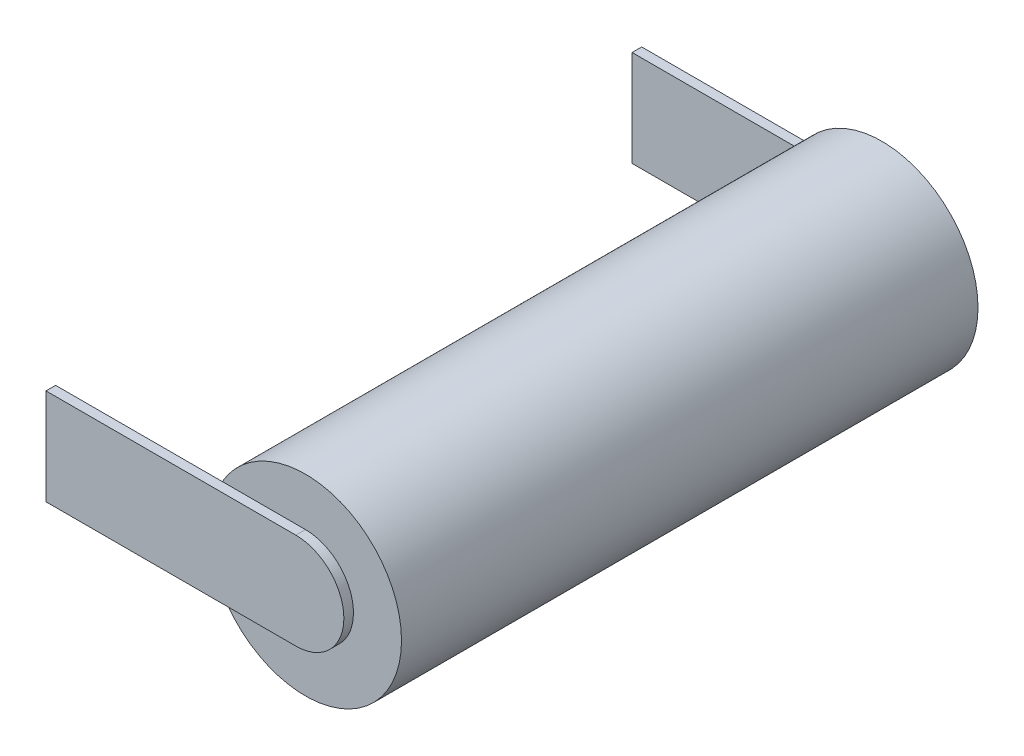
ISO-10303-21;
HEADER;
FILE_DESCRIPTION(('STEP AP214'),'2;1');
FILE_NAME('part.step','',(''),(''),'','','');
FILE_SCHEMA(('AUTOMOTIVE_DESIGN { 1 0 10303 214 1 1 1 1 }'));
ENDSEC;
DATA;
#1=APPLICATION_CONTEXT('core data for automotive mechanical design processes');
#2=APPLICATION_PROTOCOL_DEFINITION('international standard','automotive_design',2000,#1);
#3=PRODUCT_CONTEXT('',#1,'mechanical');
#4=PRODUCT('Part','Part','',(#3));
#5=PRODUCT_RELATED_PRODUCT_CATEGORY('part','',(#4));
#6=PRODUCT_DEFINITION_FORMATION('','',#4);
#7=PRODUCT_DEFINITION_CONTEXT('part definition',#1,'design');
#8=PRODUCT_DEFINITION('design','',#6,#7);
#9=PRODUCT_DEFINITION_SHAPE('','',#8);
#10=(LENGTH_UNIT() NAMED_UNIT(*) SI_UNIT(.MILLI.,.METRE.));
#11=(NAMED_UNIT(*) PLANE_ANGLE_UNIT() SI_UNIT($,.RADIAN.));
#12=(NAMED_UNIT(*) SI_UNIT($,.STERADIAN.) SOLID_ANGLE_UNIT());
#13=UNCERTAINTY_MEASURE_WITH_UNIT(LENGTH_MEASURE(1.E-05),#10,'distance_accuracy_value','');
#14=(GEOMETRIC_REPRESENTATION_CONTEXT(3) GLOBAL_UNCERTAINTY_ASSIGNED_CONTEXT((#13)) GLOBAL_UNIT_ASSIGNED_CONTEXT((#10,
#11,#12)) REPRESENTATION_CONTEXT('',''));
#15=CARTESIAN_POINT('',(0.,0.,0.));
#16=DIRECTION('',(0.,0.,1.));
#17=DIRECTION('',(1.,0.,0.));
#18=AXIS2_PLACEMENT_3D('',#15,#16,#17);
#19=CARTESIAN_POINT('',(0.,0.,15.));
#20=DIRECTION('',(0.,0.,-1.));
#21=DIRECTION('',(-1.,0.,0.));
#22=AXIS2_PLACEMENT_3D('',#19,#20,#21);
#23=PLANE('',#22);
#24=DIRECTION('',(1.,0.,0.));
#25=VECTOR('',#24,1.);
#26=CARTESIAN_POINT('',(0.,-2.5,15.));
#27=LINE('',#26,#25);
#28=CARTESIAN_POINT('',(-4.33012701892219,-2.5,15.));
#29=VERTEX_POINT('',#28);
#30=CARTESIAN_POINT('',(0.,-2.5,15.));
#31=VERTEX_POINT('',#30);
#32=EDGE_CURVE('E55',#29,#31,#27,.T.);
#33=ORIENTED_EDGE('',*,*,#32,.F.);
#34=CARTESIAN_POINT('',(0.,0.,15.));
#35=DIRECTION('',(0.,0.,1.));
#36=DIRECTION('',(1.,0.,0.));
#37=AXIS2_PLACEMENT_3D('',#34,#35,#36);
#38=CIRCLE('',#37,5.);
#39=CARTESIAN_POINT('',(-4.33012701892219,2.5,15.));
#40=VERTEX_POINT('',#39);
#41=EDGE_CURVE('E221',#29,#40,#38,.T.);
#42=ORIENTED_EDGE('',*,*,#41,.T.);
#43=DIRECTION('',(-1.,0.,0.));
#44=VECTOR('',#43,1.);
#45=CARTESIAN_POINT('',(0.,2.5,15.));
#46=LINE('',#45,#44);
#47=CARTESIAN_POINT('',(0.,2.5,15.));
#48=VERTEX_POINT('',#47);
#49=EDGE_CURVE('E204',#48,#40,#46,.T.);
#50=ORIENTED_EDGE('',*,*,#49,.F.);
#51=CARTESIAN_POINT('',(0.,0.,15.));
#52=DIRECTION('',(0.,0.,-1.));
#53=DIRECTION('',(-1.,0.,0.));
#54=AXIS2_PLACEMENT_3D('',#51,#52,#53);
#55=CIRCLE('',#54,2.5);
#56=EDGE_CURVE('E199',#48,#31,#55,.T.);
#57=ORIENTED_EDGE('',*,*,#56,.T.);
#58=EDGE_LOOP('',(#33,#42,#50,#57));
#59=FACE_BOUND('',#58,.T.);
#60=ADVANCED_FACE('F45',(#59),#23,.F.);
#61=CARTESIAN_POINT('',(0.,5.,-15.));
#62=DIRECTION('',(0.,0.,1.));
#63=DIRECTION('',(1.,0.,0.));
#64=AXIS2_PLACEMENT_3D('',#61,#62,#63);
#65=PLANE('',#64);
#66=CARTESIAN_POINT('',(0.,0.,-15.));
#67=DIRECTION('',(0.,0.,1.));
#68=DIRECTION('',(1.,0.,0.));
#69=AXIS2_PLACEMENT_3D('',#66,#67,#68);
#70=CIRCLE('',#69,5.);
#71=CARTESIAN_POINT('',(-4.33012701892219,-2.5,-15.));
#72=VERTEX_POINT('',#71);
#73=CARTESIAN_POINT('',(-4.33012701892219,2.5,-15.));
#74=VERTEX_POINT('',#73);
#75=EDGE_CURVE('E224',#72,#74,#70,.T.);
#76=ORIENTED_EDGE('',*,*,#75,.F.);
#77=DIRECTION('',(1.,0.,0.));
#78=VECTOR('',#77,1.);
#79=CARTESIAN_POINT('',(0.,-2.5,-15.));
#80=LINE('',#79,#78);
#81=CARTESIAN_POINT('',(0.,-2.5,-15.));
#82=VERTEX_POINT('',#81);
#83=EDGE_CURVE('E11',#72,#82,#80,.T.);
#84=ORIENTED_EDGE('',*,*,#83,.T.);
#85=CARTESIAN_POINT('',(0.,0.,-15.));
#86=DIRECTION('',(0.,0.,1.));
#87=DIRECTION('',(1.,0.,0.));
#88=AXIS2_PLACEMENT_3D('',#85,#86,#87);
#89=CIRCLE('',#88,2.5);
#90=CARTESIAN_POINT('',(0.,2.5,-15.));
#91=VERTEX_POINT('',#90);
#92=EDGE_CURVE('E134',#82,#91,#89,.T.);
#93=ORIENTED_EDGE('',*,*,#92,.T.);
#94=DIRECTION('',(-1.,0.,0.));
#95=VECTOR('',#94,1.);
#96=CARTESIAN_POINT('',(0.,2.5,-15.));
#97=LINE('',#96,#95);
#98=EDGE_CURVE('E160',#91,#74,#97,.T.);
#99=ORIENTED_EDGE('',*,*,#98,.T.);
#100=EDGE_LOOP('',(#76,#84,#93,#99));
#101=FACE_BOUND('',#100,.T.);
#102=ADVANCED_FACE('F47',(#101),#65,.F.);
#103=CARTESIAN_POINT('',(0.,0.,15.));
#104=DIRECTION('',(0.,0.,1.));
#105=DIRECTION('',(1.,0.,0.));
#106=AXIS2_PLACEMENT_3D('',#103,#104,#105);
#107=CYLINDRICAL_SURFACE('',#106,5.);
#108=EDGE_CURVE('E222',#40,#29,#38,.T.);
#109=ORIENTED_EDGE('',*,*,#108,.F.);
#110=ORIENTED_EDGE('',*,*,#41,.F.);
#111=EDGE_LOOP('',(#109,#110));
#112=FACE_BOUND('',#111,.T.);
#113=EDGE_CURVE('E49',#74,#72,#70,.T.);
#114=ORIENTED_EDGE('',*,*,#113,.T.);
#115=ORIENTED_EDGE('',*,*,#75,.T.);
#116=EDGE_LOOP('',(#114,#115));
#117=FACE_BOUND('',#116,.T.);
#118=ADVANCED_FACE('F237',(#112,#117),#107,.T.);
#119=CARTESIAN_POINT('',(0.,-2.5,15.5));
#120=DIRECTION('',(0.,1.,0.));
#121=DIRECTION('',(0.,0.,1.));
#122=AXIS2_PLACEMENT_3D('',#119,#120,#121);
#123=PLANE('',#122);
#124=CARTESIAN_POINT('',(-13.,-2.5,15.));
#125=VERTEX_POINT('',#124);
#126=EDGE_CURVE('E176',#125,#29,#27,.T.);
#127=ORIENTED_EDGE('',*,*,#126,.T.);
#128=ORIENTED_EDGE('',*,*,#32,.T.);
#129=DIRECTION('',(0.,0.,-1.));
#130=VECTOR('',#129,1.);
#131=CARTESIAN_POINT('',(0.,-2.5,15.5));
#132=LINE('',#131,#130);
#133=CARTESIAN_POINT('',(0.,-2.5,15.5));
#134=VERTEX_POINT('',#133);
#135=EDGE_CURVE('E72',#134,#31,#132,.T.);
#136=ORIENTED_EDGE('',*,*,#135,.F.);
#137=DIRECTION('',(1.,0.,0.));
#138=VECTOR('',#137,1.);
#139=CARTESIAN_POINT('',(0.,-2.5,15.5));
#140=LINE('',#139,#138);
#141=CARTESIAN_POINT('',(-13.,-2.5,15.5));
#142=VERTEX_POINT('',#141);
#143=EDGE_CURVE('E182',#142,#134,#140,.T.);
#144=ORIENTED_EDGE('',*,*,#143,.F.);
#145=DIRECTION('',(0.,0.,-1.));
#146=VECTOR('',#145,1.);
#147=CARTESIAN_POINT('',(-13.,-2.5,15.5));
#148=LINE('',#147,#146);
#149=EDGE_CURVE('E195',#142,#125,#148,.T.);
#150=ORIENTED_EDGE('',*,*,#149,.T.);
#151=EDGE_LOOP('',(#127,#128,#136,#144,#150));
#152=FACE_BOUND('',#151,.T.);
#153=ADVANCED_FACE('F240',(#152),#123,.F.);
#154=CARTESIAN_POINT('',(0.,0.,15.5));
#155=DIRECTION('',(0.,0.,-1.));
#156=DIRECTION('',(-1.,0.,0.));
#157=AXIS2_PLACEMENT_3D('',#154,#155,#156);
#158=CYLINDRICAL_SURFACE('',#157,2.5);
#159=ORIENTED_EDGE('',*,*,#56,.F.);
#160=DIRECTION('',(0.,0.,-1.));
#161=VECTOR('',#160,1.);
#162=CARTESIAN_POINT('',(0.,2.5,15.5));
#163=LINE('',#162,#161);
#164=CARTESIAN_POINT('',(0.,2.5,15.5));
#165=VERTEX_POINT('',#164);
#166=EDGE_CURVE('E217',#165,#48,#163,.T.);
#167=ORIENTED_EDGE('',*,*,#166,.F.);
#168=CARTESIAN_POINT('',(0.,0.,15.5));
#169=DIRECTION('',(0.,0.,-1.));
#170=DIRECTION('',(-1.,0.,0.));
#171=AXIS2_PLACEMENT_3D('',#168,#169,#170);
#172=CIRCLE('',#171,2.5);
#173=EDGE_CURVE('E185',#165,#134,#172,.T.);
#174=ORIENTED_EDGE('',*,*,#173,.T.);
#175=ORIENTED_EDGE('',*,*,#135,.T.);
#176=EDGE_LOOP('',(#159,#167,#174,#175));
#177=FACE_BOUND('',#176,.T.);
#178=ADVANCED_FACE('F248',(#177),#158,.T.);
#179=CARTESIAN_POINT('',(0.,2.5,15.5));
#180=DIRECTION('',(0.,-1.,0.));
#181=DIRECTION('',(0.,0.,-1.));
#182=AXIS2_PLACEMENT_3D('',#179,#180,#181);
#183=PLANE('',#182);
#184=ORIENTED_EDGE('',*,*,#49,.T.);
#185=CARTESIAN_POINT('',(-13.,2.5,15.));
#186=VERTEX_POINT('',#185);
#187=EDGE_CURVE('E203',#40,#186,#46,.T.);
#188=ORIENTED_EDGE('',*,*,#187,.T.);
#189=DIRECTION('',(0.,0.,-1.));
#190=VECTOR('',#189,1.);
#191=CARTESIAN_POINT('',(-13.,2.5,15.5));
#192=LINE('',#191,#190);
#193=CARTESIAN_POINT('',(-13.,2.5,15.5));
#194=VERTEX_POINT('',#193);
#195=EDGE_CURVE('E213',#194,#186,#192,.T.);
#196=ORIENTED_EDGE('',*,*,#195,.F.);
#197=DIRECTION('',(-1.,0.,0.));
#198=VECTOR('',#197,1.);
#199=CARTESIAN_POINT('',(0.,2.5,15.5));
#200=LINE('',#199,#198);
#201=EDGE_CURVE('E189',#165,#194,#200,.T.);
#202=ORIENTED_EDGE('',*,*,#201,.F.);
#203=ORIENTED_EDGE('',*,*,#166,.T.);
#204=EDGE_LOOP('',(#184,#188,#196,#202,#203));
#205=FACE_BOUND('',#204,.T.);
#206=ADVANCED_FACE('F253',(#205),#183,.F.);
#207=CARTESIAN_POINT('',(-13.,0.,15.5));
#208=DIRECTION('',(1.,0.,0.));
#209=DIRECTION('',(0.,0.,-1.));
#210=AXIS2_PLACEMENT_3D('',#207,#208,#209);
#211=PLANE('',#210);
#212=DIRECTION('',(0.,-1.,0.));
#213=VECTOR('',#212,1.);
#214=CARTESIAN_POINT('',(-13.,0.,15.));
#215=LINE('',#214,#213);
#216=EDGE_CURVE('E186',#186,#125,#215,.T.);
#217=ORIENTED_EDGE('',*,*,#216,.T.);
#218=ORIENTED_EDGE('',*,*,#149,.F.);
#219=DIRECTION('',(0.,-1.,0.));
#220=VECTOR('',#219,1.);
#221=CARTESIAN_POINT('',(-13.,0.,15.5));
#222=LINE('',#221,#220);
#223=EDGE_CURVE('E192',#194,#142,#222,.T.);
#224=ORIENTED_EDGE('',*,*,#223,.F.);
#225=ORIENTED_EDGE('',*,*,#195,.T.);
#226=EDGE_LOOP('',(#217,#218,#224,#225));
#227=FACE_BOUND('',#226,.T.);
#228=ADVANCED_FACE('F261',(#227),#211,.F.);
#229=CARTESIAN_POINT('',(0.,0.,15.5));
#230=DIRECTION('',(0.,0.,-1.));
#231=DIRECTION('',(-1.,0.,0.));
#232=AXIS2_PLACEMENT_3D('',#229,#230,#231);
#233=PLANE('',#232);
#234=ORIENTED_EDGE('',*,*,#143,.T.);
#235=ORIENTED_EDGE('',*,*,#173,.F.);
#236=ORIENTED_EDGE('',*,*,#201,.T.);
#237=ORIENTED_EDGE('',*,*,#223,.T.);
#238=EDGE_LOOP('',(#234,#235,#236,#237));
#239=FACE_BOUND('',#238,.T.);
#240=ADVANCED_FACE('F256',(#239),#233,.F.);
#241=CARTESIAN_POINT('',(0.,0.,15.));
#242=DIRECTION('',(0.,0.,-1.));
#243=DIRECTION('',(-1.,0.,0.));
#244=AXIS2_PLACEMENT_3D('',#241,#242,#243);
#245=PLANE('',#244);
#246=ORIENTED_EDGE('',*,*,#187,.F.);
#247=ORIENTED_EDGE('',*,*,#108,.T.);
#248=ORIENTED_EDGE('',*,*,#126,.F.);
#249=ORIENTED_EDGE('',*,*,#216,.F.);
#250=EDGE_LOOP('',(#246,#247,#248,#249));
#251=FACE_BOUND('',#250,.T.);
#252=ADVANCED_FACE('F260',(#251),#245,.T.);
#253=CARTESIAN_POINT('',(0.,0.,-15.));
#254=DIRECTION('',(0.,0.,1.));
#255=DIRECTION('',(1.,0.,0.));
#256=AXIS2_PLACEMENT_3D('',#253,#254,#255);
#257=PLANE('',#256);
#258=ORIENTED_EDGE('',*,*,#113,.F.);
#259=CARTESIAN_POINT('',(-13.,2.5,-15.));
#260=VERTEX_POINT('',#259);
#261=EDGE_CURVE('E64',#74,#260,#97,.T.);
#262=ORIENTED_EDGE('',*,*,#261,.T.);
#263=DIRECTION('',(0.,-1.,0.));
#264=VECTOR('',#263,1.);
#265=CARTESIAN_POINT('',(-13.,5.,-15.));
#266=LINE('',#265,#264);
#267=CARTESIAN_POINT('',(-13.,-2.5,-15.));
#268=VERTEX_POINT('',#267);
#269=EDGE_CURVE('E156',#260,#268,#266,.T.);
#270=ORIENTED_EDGE('',*,*,#269,.T.);
#271=EDGE_CURVE('E57',#268,#72,#80,.T.);
#272=ORIENTED_EDGE('',*,*,#271,.T.);
#273=EDGE_LOOP('',(#258,#262,#270,#272));
#274=FACE_BOUND('',#273,.T.);
#275=ADVANCED_FACE('F310',(#274),#257,.T.);
#276=CARTESIAN_POINT('',(0.,-2.5,-15.5));
#277=DIRECTION('',(0.,-1.,0.));
#278=DIRECTION('',(0.,0.,-1.));
#279=AXIS2_PLACEMENT_3D('',#276,#277,#278);
#280=PLANE('',#279);
#281=ORIENTED_EDGE('',*,*,#271,.F.);
#282=DIRECTION('',(0.,0.,1.));
#283=VECTOR('',#282,1.);
#284=CARTESIAN_POINT('',(-13.,-2.5,-15.5));
#285=LINE('',#284,#283);
#286=CARTESIAN_POINT('',(-13.,-2.5,-15.5));
#287=VERTEX_POINT('',#286);
#288=EDGE_CURVE('E154',#287,#268,#285,.T.);
#289=ORIENTED_EDGE('',*,*,#288,.F.);
#290=DIRECTION('',(1.,0.,0.));
#291=VECTOR('',#290,1.);
#292=CARTESIAN_POINT('',(0.,-2.5,-15.5));
#293=LINE('',#292,#291);
#294=CARTESIAN_POINT('',(0.,-2.5,-15.5));
#295=VERTEX_POINT('',#294);
#296=EDGE_CURVE('E146',#287,#295,#293,.T.);
#297=ORIENTED_EDGE('',*,*,#296,.T.);
#298=DIRECTION('',(0.,0.,1.));
#299=VECTOR('',#298,1.);
#300=CARTESIAN_POINT('',(0.,-2.5,-15.5));
#301=LINE('',#300,#299);
#302=EDGE_CURVE('E129',#295,#82,#301,.T.);
#303=ORIENTED_EDGE('',*,*,#302,.T.);
#304=ORIENTED_EDGE('',*,*,#83,.F.);
#305=EDGE_LOOP('',(#281,#289,#297,#303,#304));
#306=FACE_BOUND('',#305,.T.);
#307=ADVANCED_FACE('F153',(#306),#280,.T.);
#308=CARTESIAN_POINT('',(-13.,5.,-15.5));
#309=DIRECTION('',(-1.,0.,0.));
#310=DIRECTION('',(0.,0.,1.));
#311=AXIS2_PLACEMENT_3D('',#308,#309,#310);
#312=PLANE('',#311);
#313=ORIENTED_EDGE('',*,*,#269,.F.);
#314=DIRECTION('',(0.,0.,1.));
#315=VECTOR('',#314,1.);
#316=CARTESIAN_POINT('',(-13.,2.5,-15.5));
#317=LINE('',#316,#315);
#318=CARTESIAN_POINT('',(-13.,2.5,-15.5));
#319=VERTEX_POINT('',#318);
#320=EDGE_CURVE('E177',#319,#260,#317,.T.);
#321=ORIENTED_EDGE('',*,*,#320,.F.);
#322=DIRECTION('',(0.,-1.,0.));
#323=VECTOR('',#322,1.);
#324=CARTESIAN_POINT('',(-13.,5.,-15.5));
#325=LINE('',#324,#323);
#326=EDGE_CURVE('E139',#319,#287,#325,.T.);
#327=ORIENTED_EDGE('',*,*,#326,.T.);
#328=ORIENTED_EDGE('',*,*,#288,.T.);
#329=EDGE_LOOP('',(#313,#321,#327,#328));
#330=FACE_BOUND('',#329,.T.);
#331=ADVANCED_FACE('F326',(#330),#312,.T.);
#332=CARTESIAN_POINT('',(0.,2.5,-15.5));
#333=DIRECTION('',(0.,1.,0.));
#334=DIRECTION('',(0.,0.,1.));
#335=AXIS2_PLACEMENT_3D('',#332,#333,#334);
#336=PLANE('',#335);
#337=ORIENTED_EDGE('',*,*,#98,.F.);
#338=DIRECTION('',(0.,0.,1.));
#339=VECTOR('',#338,1.);
#340=CARTESIAN_POINT('',(0.,2.5,-15.5));
#341=LINE('',#340,#339);
#342=CARTESIAN_POINT('',(0.,2.5,-15.5));
#343=VERTEX_POINT('',#342);
#344=EDGE_CURVE('E138',#343,#91,#341,.T.);
#345=ORIENTED_EDGE('',*,*,#344,.F.);
#346=DIRECTION('',(-1.,0.,0.));
#347=VECTOR('',#346,1.);
#348=CARTESIAN_POINT('',(0.,2.5,-15.5));
#349=LINE('',#348,#347);
#350=EDGE_CURVE('E149',#343,#319,#349,.T.);
#351=ORIENTED_EDGE('',*,*,#350,.T.);
#352=ORIENTED_EDGE('',*,*,#320,.T.);
#353=ORIENTED_EDGE('',*,*,#261,.F.);
#354=EDGE_LOOP('',(#337,#345,#351,#352,#353));
#355=FACE_BOUND('',#354,.T.);
#356=ADVANCED_FACE('F335',(#355),#336,.T.);
#357=CARTESIAN_POINT('',(0.,0.,-15.5));
#358=DIRECTION('',(0.,0.,1.));
#359=DIRECTION('',(1.,0.,0.));
#360=AXIS2_PLACEMENT_3D('',#357,#358,#359);
#361=CYLINDRICAL_SURFACE('',#360,2.5);
#362=ORIENTED_EDGE('',*,*,#92,.F.);
#363=ORIENTED_EDGE('',*,*,#302,.F.);
#364=CARTESIAN_POINT('',(0.,0.,-15.5));
#365=DIRECTION('',(0.,0.,1.));
#366=DIRECTION('',(1.,0.,0.));
#367=AXIS2_PLACEMENT_3D('',#364,#365,#366);
#368=CIRCLE('',#367,2.5);
#369=EDGE_CURVE('E132',#295,#343,#368,.T.);
#370=ORIENTED_EDGE('',*,*,#369,.T.);
#371=ORIENTED_EDGE('',*,*,#344,.T.);
#372=EDGE_LOOP('',(#362,#363,#370,#371));
#373=FACE_BOUND('',#372,.T.);
#374=ADVANCED_FACE('F131',(#373),#361,.T.);
#375=CARTESIAN_POINT('',(0.,0.,-15.5));
#376=DIRECTION('',(0.,0.,1.));
#377=DIRECTION('',(1.,0.,0.));
#378=AXIS2_PLACEMENT_3D('',#375,#376,#377);
#379=PLANE('',#378);
#380=ORIENTED_EDGE('',*,*,#296,.F.);
#381=ORIENTED_EDGE('',*,*,#326,.F.);
#382=ORIENTED_EDGE('',*,*,#350,.F.);
#383=ORIENTED_EDGE('',*,*,#369,.F.);
#384=EDGE_LOOP('',(#380,#381,#382,#383));
#385=FACE_BOUND('',#384,.T.);
#386=ADVANCED_FACE('F144',(#385),#379,.F.);
#387=CLOSED_SHELL('',(#60,#102,#118,#153,#178,#206,#228,#240,#252,#275,#307,#331,#356,#374,#386));
#388=MANIFOLD_SOLID_BREP('B2',#387);
#389=ADVANCED_BREP_SHAPE_REPRESENTATION('',(#18,#388),#14);
#390=SHAPE_DEFINITION_REPRESENTATION(#9,#389);
ENDSEC;
END-ISO-10303-21;
